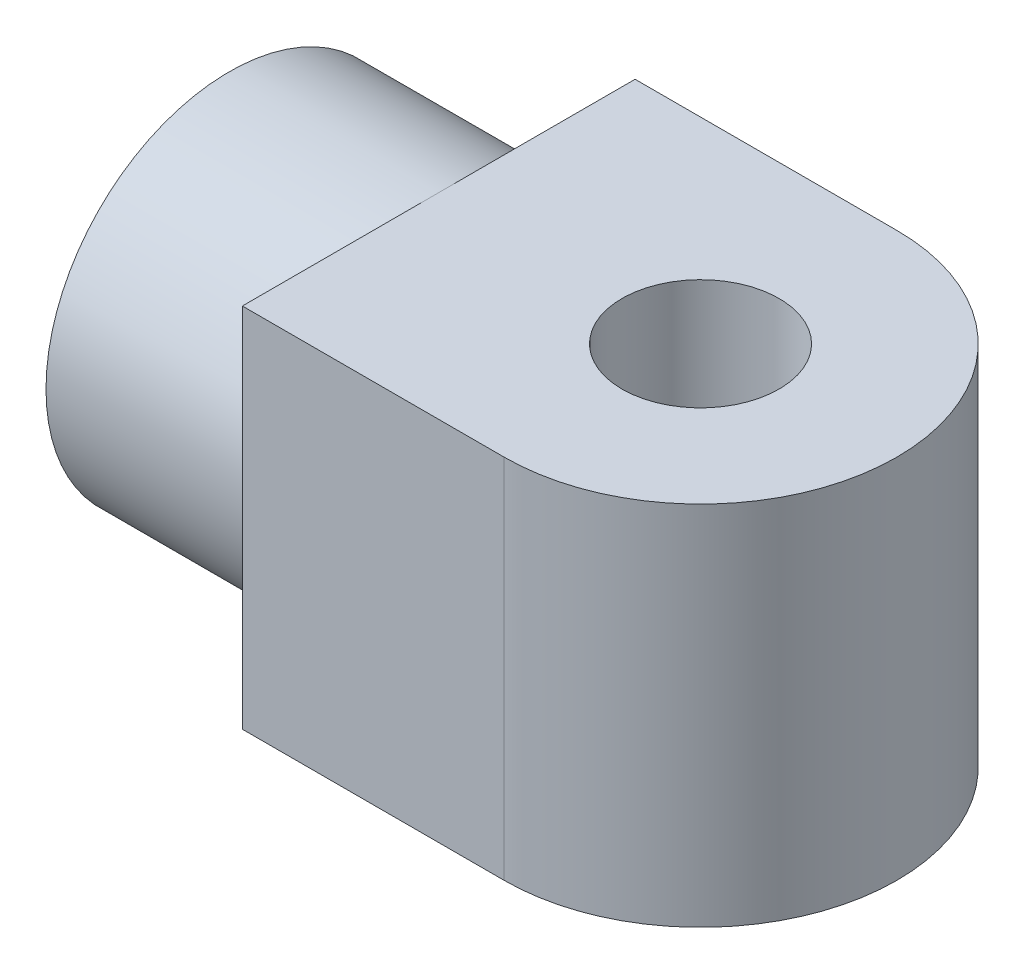
ISO-10303-21;
HEADER;
FILE_DESCRIPTION(('STEP AP214'),'2;1');
FILE_NAME('part.step','',(''),(''),'','','');
FILE_SCHEMA(('AUTOMOTIVE_DESIGN { 1 0 10303 214 1 1 1 1 }'));
ENDSEC;
DATA;
#1=APPLICATION_CONTEXT('core data for automotive mechanical design processes');
#2=APPLICATION_PROTOCOL_DEFINITION('international standard','automotive_design',2000,#1);
#3=PRODUCT_CONTEXT('',#1,'mechanical');
#4=PRODUCT('Part','Part','',(#3));
#5=PRODUCT_RELATED_PRODUCT_CATEGORY('part','',(#4));
#6=PRODUCT_DEFINITION_FORMATION('','',#4);
#7=PRODUCT_DEFINITION_CONTEXT('part definition',#1,'design');
#8=PRODUCT_DEFINITION('design','',#6,#7);
#9=PRODUCT_DEFINITION_SHAPE('','',#8);
#10=(LENGTH_UNIT() NAMED_UNIT(*) SI_UNIT(.MILLI.,.METRE.));
#11=(NAMED_UNIT(*) PLANE_ANGLE_UNIT() SI_UNIT($,.RADIAN.));
#12=(NAMED_UNIT(*) SI_UNIT($,.STERADIAN.) SOLID_ANGLE_UNIT());
#13=UNCERTAINTY_MEASURE_WITH_UNIT(LENGTH_MEASURE(1.E-05),#10,'distance_accuracy_value','');
#14=(GEOMETRIC_REPRESENTATION_CONTEXT(3) GLOBAL_UNCERTAINTY_ASSIGNED_CONTEXT((#13)) GLOBAL_UNIT_ASSIGNED_CONTEXT((#10,
#11,#12)) REPRESENTATION_CONTEXT('',''));
#15=CARTESIAN_POINT('',(0.,0.,0.));
#16=DIRECTION('',(0.,0.,1.));
#17=DIRECTION('',(1.,0.,0.));
#18=AXIS2_PLACEMENT_3D('',#15,#16,#17);
#19=CARTESIAN_POINT('',(-5.,14.,-7.5));
#20=DIRECTION('',(1.,0.,0.));
#21=DIRECTION('',(0.,0.,-1.));
#22=AXIS2_PLACEMENT_3D('',#19,#20,#21);
#23=PLANE('',#22);
#24=CARTESIAN_POINT('',(-5.,7.00000000000031,0.));
#25=DIRECTION('',(-1.,0.,0.));
#26=DIRECTION('',(0.,0.,1.));
#27=AXIS2_PLACEMENT_3D('',#24,#25,#26);
#28=CIRCLE('',#27,7.);
#29=CARTESIAN_POINT('',(-5.,14.0000000000003,0.));
#30=VERTEX_POINT('',#29);
#31=CARTESIAN_POINT('',(-5.,0.,0.));
#32=VERTEX_POINT('',#31);
#33=EDGE_CURVE('E50',#30,#32,#28,.T.);
#34=ORIENTED_EDGE('',*,*,#33,.F.);
#35=DIRECTION('',(0.,0.,1.));
#36=VECTOR('',#35,1.);
#37=CARTESIAN_POINT('',(-5.,14.,-7.5));
#38=LINE('',#37,#36);
#39=CARTESIAN_POINT('',(-5.,14.,-7.5));
#40=VERTEX_POINT('',#39);
#41=EDGE_CURVE('E96',#40,#30,#38,.T.);
#42=ORIENTED_EDGE('',*,*,#41,.F.);
#43=DIRECTION('',(0.,-1.,0.));
#44=VECTOR('',#43,1.);
#45=CARTESIAN_POINT('',(-5.,14.,-7.5));
#46=LINE('',#45,#44);
#47=CARTESIAN_POINT('',(-5.,0.,-7.5));
#48=VERTEX_POINT('',#47);
#49=EDGE_CURVE('E152',#40,#48,#46,.T.);
#50=ORIENTED_EDGE('',*,*,#49,.T.);
#51=DIRECTION('',(0.,0.,1.));
#52=VECTOR('',#51,1.);
#53=CARTESIAN_POINT('',(-5.,0.,-7.5));
#54=LINE('',#53,#52);
#55=EDGE_CURVE('E110',#48,#32,#54,.T.);
#56=ORIENTED_EDGE('',*,*,#55,.T.);
#57=EDGE_LOOP('',(#34,#42,#50,#56));
#58=FACE_BOUND('',#57,.T.);
#59=ADVANCED_FACE('F40',(#58),#23,.F.);
#60=CARTESIAN_POINT('',(5.,14.,0.));
#61=DIRECTION('',(0.,1.,0.));
#62=DIRECTION('',(0.,0.,1.));
#63=AXIS2_PLACEMENT_3D('',#60,#61,#62);
#64=PLANE('',#63);
#65=CARTESIAN_POINT('',(5.,14.,0.));
#66=DIRECTION('',(0.,1.,0.));
#67=DIRECTION('',(0.,0.,1.));
#68=AXIS2_PLACEMENT_3D('',#65,#66,#67);
#69=CIRCLE('',#68,7.5);
#70=CARTESIAN_POINT('',(5.,14.,7.5));
#71=VERTEX_POINT('',#70);
#72=CARTESIAN_POINT('',(5.,14.,-7.5));
#73=VERTEX_POINT('',#72);
#74=EDGE_CURVE('E162',#71,#73,#69,.T.);
#75=ORIENTED_EDGE('',*,*,#74,.T.);
#76=DIRECTION('',(-1.,0.,0.));
#77=VECTOR('',#76,1.);
#78=CARTESIAN_POINT('',(-5.,14.,-7.5));
#79=LINE('',#78,#77);
#80=EDGE_CURVE('E92',#73,#40,#79,.T.);
#81=ORIENTED_EDGE('',*,*,#80,.T.);
#82=ORIENTED_EDGE('',*,*,#41,.T.);
#83=CARTESIAN_POINT('',(-5.,14.,7.5));
#84=VERTEX_POINT('',#83);
#85=EDGE_CURVE('E99',#30,#84,#38,.T.);
#86=ORIENTED_EDGE('',*,*,#85,.T.);
#87=DIRECTION('',(1.,0.,0.));
#88=VECTOR('',#87,1.);
#89=CARTESIAN_POINT('',(-5.,14.,7.5));
#90=LINE('',#89,#88);
#91=EDGE_CURVE('E64',#84,#71,#90,.T.);
#92=ORIENTED_EDGE('',*,*,#91,.T.);
#93=EDGE_LOOP('',(#75,#81,#82,#86,#92));
#94=FACE_BOUND('',#93,.T.);
#95=CARTESIAN_POINT('',(5.,14.,0.));
#96=DIRECTION('',(0.,1.,0.));
#97=DIRECTION('',(0.,0.,1.));
#98=AXIS2_PLACEMENT_3D('',#95,#96,#97);
#99=CIRCLE('',#98,3.);
#100=CARTESIAN_POINT('',(5.,14.,3.));
#101=VERTEX_POINT('',#100);
#102=EDGE_CURVE('E168',#101,#101,#99,.T.);
#103=ORIENTED_EDGE('',*,*,#102,.F.);
#104=EDGE_LOOP('',(#103));
#105=FACE_BOUND('',#104,.T.);
#106=ADVANCED_FACE('F97',(#94,#105),#64,.T.);
#107=CARTESIAN_POINT('',(5.,0.,0.));
#108=DIRECTION('',(0.,1.,0.));
#109=DIRECTION('',(0.,0.,1.));
#110=AXIS2_PLACEMENT_3D('',#107,#108,#109);
#111=PLANE('',#110);
#112=CARTESIAN_POINT('',(5.,0.,0.));
#113=DIRECTION('',(0.,1.,0.));
#114=DIRECTION('',(0.,0.,1.));
#115=AXIS2_PLACEMENT_3D('',#112,#113,#114);
#116=CIRCLE('',#115,7.5);
#117=CARTESIAN_POINT('',(5.,0.,7.5));
#118=VERTEX_POINT('',#117);
#119=CARTESIAN_POINT('',(5.,0.,-7.5));
#120=VERTEX_POINT('',#119);
#121=EDGE_CURVE('E158',#118,#120,#116,.T.);
#122=ORIENTED_EDGE('',*,*,#121,.F.);
#123=DIRECTION('',(1.,0.,0.));
#124=VECTOR('',#123,1.);
#125=CARTESIAN_POINT('',(-5.,0.,7.5));
#126=LINE('',#125,#124);
#127=CARTESIAN_POINT('',(-5.,0.,7.5));
#128=VERTEX_POINT('',#127);
#129=EDGE_CURVE('E84',#128,#118,#126,.T.);
#130=ORIENTED_EDGE('',*,*,#129,.F.);
#131=EDGE_CURVE('E157',#32,#128,#54,.T.);
#132=ORIENTED_EDGE('',*,*,#131,.F.);
#133=ORIENTED_EDGE('',*,*,#55,.F.);
#134=DIRECTION('',(-1.,0.,0.));
#135=VECTOR('',#134,1.);
#136=CARTESIAN_POINT('',(-5.,0.,-7.5));
#137=LINE('',#136,#135);
#138=EDGE_CURVE('E151',#120,#48,#137,.T.);
#139=ORIENTED_EDGE('',*,*,#138,.F.);
#140=EDGE_LOOP('',(#122,#130,#132,#133,#139));
#141=FACE_BOUND('',#140,.T.);
#142=CARTESIAN_POINT('',(5.,0.,0.));
#143=DIRECTION('',(0.,1.,0.));
#144=DIRECTION('',(0.,0.,1.));
#145=AXIS2_PLACEMENT_3D('',#142,#143,#144);
#146=CIRCLE('',#145,3.);
#147=CARTESIAN_POINT('',(5.,0.,3.));
#148=VERTEX_POINT('',#147);
#149=EDGE_CURVE('E170',#148,#148,#146,.T.);
#150=ORIENTED_EDGE('',*,*,#149,.T.);
#151=EDGE_LOOP('',(#150));
#152=FACE_BOUND('',#151,.T.);
#153=ADVANCED_FACE('F137',(#141,#152),#111,.F.);
#154=CARTESIAN_POINT('',(5.,14.,0.));
#155=DIRECTION('',(0.,-1.,0.));
#156=DIRECTION('',(0.,0.,-1.));
#157=AXIS2_PLACEMENT_3D('',#154,#155,#156);
#158=CYLINDRICAL_SURFACE('',#157,7.5);
#159=ORIENTED_EDGE('',*,*,#121,.T.);
#160=DIRECTION('',(0.,-1.,0.));
#161=VECTOR('',#160,1.);
#162=CARTESIAN_POINT('',(5.,14.,-7.5));
#163=LINE('',#162,#161);
#164=EDGE_CURVE('E44',#73,#120,#163,.T.);
#165=ORIENTED_EDGE('',*,*,#164,.F.);
#166=ORIENTED_EDGE('',*,*,#74,.F.);
#167=DIRECTION('',(0.,-1.,0.));
#168=VECTOR('',#167,1.);
#169=CARTESIAN_POINT('',(5.,14.,7.5));
#170=LINE('',#169,#168);
#171=EDGE_CURVE('E166',#71,#118,#170,.T.);
#172=ORIENTED_EDGE('',*,*,#171,.T.);
#173=EDGE_LOOP('',(#159,#165,#166,#172));
#174=FACE_BOUND('',#173,.T.);
#175=ADVANCED_FACE('F42',(#174),#158,.T.);
#176=CARTESIAN_POINT('',(-5.,14.,-7.5));
#177=DIRECTION('',(0.,0.,1.));
#178=DIRECTION('',(1.,0.,0.));
#179=AXIS2_PLACEMENT_3D('',#176,#177,#178);
#180=PLANE('',#179);
#181=ORIENTED_EDGE('',*,*,#138,.T.);
#182=ORIENTED_EDGE('',*,*,#49,.F.);
#183=ORIENTED_EDGE('',*,*,#80,.F.);
#184=ORIENTED_EDGE('',*,*,#164,.T.);
#185=EDGE_LOOP('',(#181,#182,#183,#184));
#186=FACE_BOUND('',#185,.T.);
#187=ADVANCED_FACE('F142',(#186),#180,.F.);
#188=EDGE_CURVE('E11',#32,#30,#28,.T.);
#189=ORIENTED_EDGE('',*,*,#188,.F.);
#190=ORIENTED_EDGE('',*,*,#131,.T.);
#191=DIRECTION('',(0.,-1.,0.));
#192=VECTOR('',#191,1.);
#193=CARTESIAN_POINT('',(-5.,14.,7.5));
#194=LINE('',#193,#192);
#195=EDGE_CURVE('E106',#84,#128,#194,.T.);
#196=ORIENTED_EDGE('',*,*,#195,.F.);
#197=ORIENTED_EDGE('',*,*,#85,.F.);
#198=EDGE_LOOP('',(#189,#190,#196,#197));
#199=FACE_BOUND('',#198,.T.);
#200=ADVANCED_FACE('F105',(#199),#23,.F.);
#201=CARTESIAN_POINT('',(-5.,14.,7.5));
#202=DIRECTION('',(0.,0.,-1.));
#203=DIRECTION('',(-1.,0.,0.));
#204=AXIS2_PLACEMENT_3D('',#201,#202,#203);
#205=PLANE('',#204);
#206=ORIENTED_EDGE('',*,*,#129,.T.);
#207=ORIENTED_EDGE('',*,*,#171,.F.);
#208=ORIENTED_EDGE('',*,*,#91,.F.);
#209=ORIENTED_EDGE('',*,*,#195,.T.);
#210=EDGE_LOOP('',(#206,#207,#208,#209));
#211=FACE_BOUND('',#210,.T.);
#212=ADVANCED_FACE('F141',(#211),#205,.F.);
#213=CARTESIAN_POINT('',(5.,14.,0.));
#214=DIRECTION('',(0.,-1.,0.));
#215=DIRECTION('',(0.,0.,-1.));
#216=AXIS2_PLACEMENT_3D('',#213,#214,#215);
#217=CYLINDRICAL_SURFACE('',#216,3.);
#218=ORIENTED_EDGE('',*,*,#102,.T.);
#219=EDGE_LOOP('',(#218));
#220=FACE_BOUND('',#219,.T.);
#221=ORIENTED_EDGE('',*,*,#149,.F.);
#222=EDGE_LOOP('',(#221));
#223=FACE_BOUND('',#222,.T.);
#224=ADVANCED_FACE('F127',(#220,#223),#217,.F.);
#225=CARTESIAN_POINT('',(-13.,7.00000000000031,0.));
#226=DIRECTION('',(-1.,0.,0.));
#227=DIRECTION('',(0.,0.,1.));
#228=AXIS2_PLACEMENT_3D('',#225,#226,#227);
#229=PLANE('',#228);
#230=CARTESIAN_POINT('',(-13.,7.00000000000031,0.));
#231=DIRECTION('',(-1.,0.,0.));
#232=DIRECTION('',(0.,0.,1.));
#233=AXIS2_PLACEMENT_3D('',#230,#231,#232);
#234=CIRCLE('',#233,7.);
#235=CARTESIAN_POINT('',(-13.,7.00000000000031,6.99999999999992));
#236=VERTEX_POINT('',#235);
#237=EDGE_CURVE('E112',#236,#236,#234,.T.);
#238=ORIENTED_EDGE('',*,*,#237,.T.);
#239=EDGE_LOOP('',(#238));
#240=FACE_BOUND('',#239,.T.);
#241=CARTESIAN_POINT('',(-13.,7.00000000000031,0.));
#242=DIRECTION('',(-1.,0.,0.));
#243=DIRECTION('',(0.,0.,1.));
#244=AXIS2_PLACEMENT_3D('',#241,#242,#243);
#245=CIRCLE('',#244,4.);
#246=CARTESIAN_POINT('',(-13.,7.00000000000031,3.99999999999992));
#247=VERTEX_POINT('',#246);
#248=EDGE_CURVE('E113',#247,#247,#245,.T.);
#249=ORIENTED_EDGE('',*,*,#248,.F.);
#250=EDGE_LOOP('',(#249));
#251=FACE_BOUND('',#250,.T.);
#252=ADVANCED_FACE('F117',(#240,#251),#229,.T.);
#253=CARTESIAN_POINT('',(-13.,7.00000000000031,0.));
#254=DIRECTION('',(1.,0.,0.));
#255=DIRECTION('',(0.,0.,-1.));
#256=AXIS2_PLACEMENT_3D('',#253,#254,#255);
#257=CYLINDRICAL_SURFACE('',#256,7.);
#258=ORIENTED_EDGE('',*,*,#237,.F.);
#259=EDGE_LOOP('',(#258));
#260=FACE_BOUND('',#259,.T.);
#261=ORIENTED_EDGE('',*,*,#33,.T.);
#262=ORIENTED_EDGE('',*,*,#188,.T.);
#263=EDGE_LOOP('',(#261,#262));
#264=FACE_BOUND('',#263,.T.);
#265=ADVANCED_FACE('F114',(#260,#264),#257,.T.);
#266=CARTESIAN_POINT('',(-13.,7.00000000000031,0.));
#267=DIRECTION('',(1.,0.,0.));
#268=DIRECTION('',(0.,0.,-1.));
#269=AXIS2_PLACEMENT_3D('',#266,#267,#268);
#270=CYLINDRICAL_SURFACE('',#269,4.);
#271=ORIENTED_EDGE('',*,*,#248,.T.);
#272=EDGE_LOOP('',(#271));
#273=FACE_BOUND('',#272,.T.);
#274=CARTESIAN_POINT('',(-1.,7.00000000000028,0.));
#275=DIRECTION('',(-1.00000000000001,0.,0.));
#276=DIRECTION('',(0.,0.,1.00000000000001));
#277=AXIS2_PLACEMENT_3D('',#274,#275,#276);
#278=CIRCLE('',#277,4.);
#279=CARTESIAN_POINT('',(-0.999999999999993,7.00000000000029,3.99999999999994));
#280=VERTEX_POINT('',#279);
#281=EDGE_CURVE('E182',#280,#280,#278,.T.);
#282=ORIENTED_EDGE('',*,*,#281,.F.);
#283=EDGE_LOOP('',(#282));
#284=FACE_BOUND('',#283,.T.);
#285=ADVANCED_FACE('F116',(#273,#284),#270,.F.);
#286=CARTESIAN_POINT('',(-1.00000000000023,-1.21430643318376E-13,0.));
#287=DIRECTION('',(-1.00000000000001,0.,0.));
#288=DIRECTION('',(0.,0.,1.00000000000001));
#289=AXIS2_PLACEMENT_3D('',#286,#287,#288);
#290=PLANE('',#289);
#291=ORIENTED_EDGE('',*,*,#281,.T.);
#292=EDGE_LOOP('',(#291));
#293=FACE_BOUND('',#292,.T.);
#294=ADVANCED_FACE('F124',(#293),#290,.T.);
#295=CLOSED_SHELL('',(#59,#106,#153,#175,#187,#200,#212,#224,#252,#265,#285,#294));
#296=MANIFOLD_SOLID_BREP('B2',#295);
#297=ADVANCED_BREP_SHAPE_REPRESENTATION('',(#18,#296),#14);
#298=SHAPE_DEFINITION_REPRESENTATION(#9,#297);
ENDSEC;
END-ISO-10303-21;
